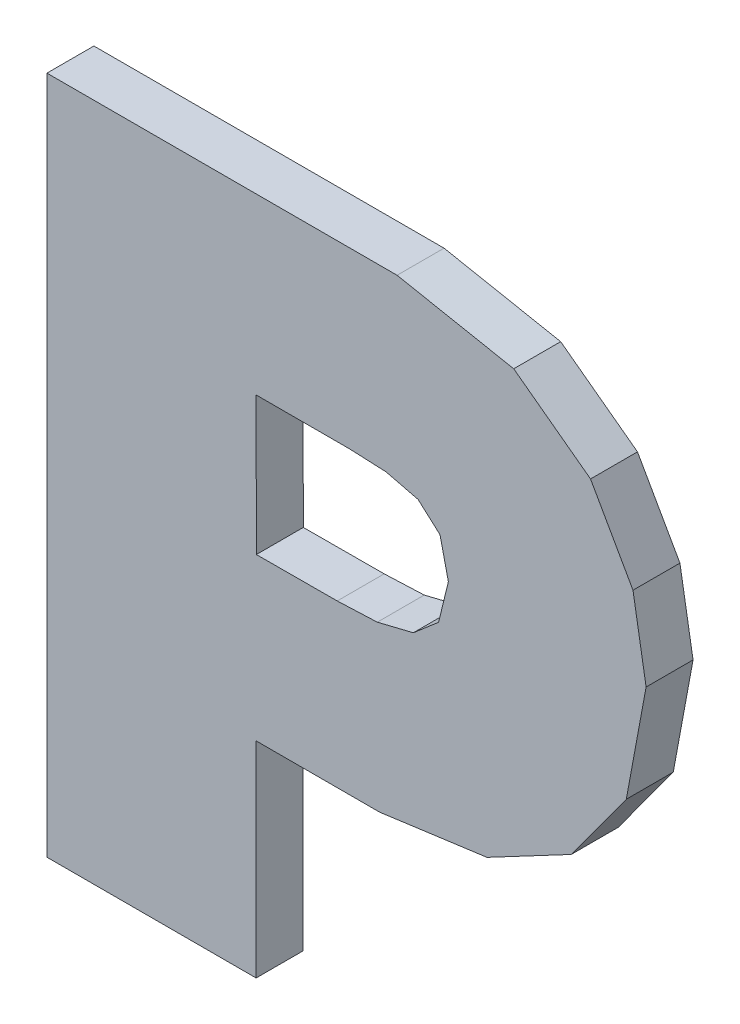
ISO-10303-21;
HEADER;
FILE_DESCRIPTION(('STEP AP214'),'2;1');
FILE_NAME('part.step','',(''),(''),'','','');
FILE_SCHEMA(('AUTOMOTIVE_DESIGN { 1 0 10303 214 1 1 1 1 }'));
ENDSEC;
DATA;
#1=APPLICATION_CONTEXT('core data for automotive mechanical design processes');
#2=APPLICATION_PROTOCOL_DEFINITION('international standard','automotive_design',2000,#1);
#3=PRODUCT_CONTEXT('',#1,'mechanical');
#4=PRODUCT('Part','Part','',(#3));
#5=PRODUCT_RELATED_PRODUCT_CATEGORY('part','',(#4));
#6=PRODUCT_DEFINITION_FORMATION('','',#4);
#7=PRODUCT_DEFINITION_CONTEXT('part definition',#1,'design');
#8=PRODUCT_DEFINITION('design','',#6,#7);
#9=PRODUCT_DEFINITION_SHAPE('','',#8);
#10=(LENGTH_UNIT() NAMED_UNIT(*) SI_UNIT(.MILLI.,.METRE.));
#11=(NAMED_UNIT(*) PLANE_ANGLE_UNIT() SI_UNIT($,.RADIAN.));
#12=(NAMED_UNIT(*) SI_UNIT($,.STERADIAN.) SOLID_ANGLE_UNIT());
#13=UNCERTAINTY_MEASURE_WITH_UNIT(LENGTH_MEASURE(1.E-05),#10,'distance_accuracy_value','');
#14=(GEOMETRIC_REPRESENTATION_CONTEXT(3) GLOBAL_UNCERTAINTY_ASSIGNED_CONTEXT((#13)) GLOBAL_UNIT_ASSIGNED_CONTEXT((#10,
#11,#12)) REPRESENTATION_CONTEXT('',''));
#15=CARTESIAN_POINT('',(0.,0.,0.));
#16=DIRECTION('',(0.,0.,1.));
#17=DIRECTION('',(1.,0.,0.));
#18=AXIS2_PLACEMENT_3D('',#15,#16,#17);
#19=CARTESIAN_POINT('',(0.,0.,0.));
#20=DIRECTION('',(0.,0.,1.));
#21=DIRECTION('',(1.,0.,0.));
#22=AXIS2_PLACEMENT_3D('',#19,#20,#21);
#23=PLANE('',#22);
#24=DIRECTION('',(-0.999133073092352,-0.041630544712178,0.));
#25=VECTOR('',#24,1.);
#26=CARTESIAN_POINT('',(3.64744,1.047242,0.));
#27=LINE('',#26,#25);
#28=CARTESIAN_POINT('',(3.64744,1.047242,0.));
#29=VERTEX_POINT('',#28);
#30=CARTESIAN_POINT('',(3.604768,1.045464,0.));
#31=VERTEX_POINT('',#30);
#32=EDGE_CURVE('E292',#29,#31,#27,.T.);
#33=ORIENTED_EDGE('',*,*,#32,.F.);
#34=DIRECTION('',(-0.971266974943377,-0.237992570019194,0.));
#35=VECTOR('',#34,1.);
#36=CARTESIAN_POINT('',(3.685794,1.05664,0.));
#37=LINE('',#36,#35);
#38=CARTESIAN_POINT('',(3.685794,1.05664,0.));
#39=VERTEX_POINT('',#38);
#40=EDGE_CURVE('E287',#39,#29,#37,.T.);
#41=ORIENTED_EDGE('',*,*,#40,.F.);
#42=DIRECTION('',(-0.758751100874912,-0.65138066207181,0.));
#43=VECTOR('',#42,1.);
#44=CARTESIAN_POINT('',(3.712718,1.079754,0.));
#45=LINE('',#44,#43);
#46=CARTESIAN_POINT('',(3.712718,1.079754,0.));
#47=VERTEX_POINT('',#46);
#48=EDGE_CURVE('E282',#47,#39,#45,.T.);
#49=ORIENTED_EDGE('',*,*,#48,.F.);
#50=DIRECTION('',(-0.2370892994148,-0.971487861016801,0.));
#51=VECTOR('',#50,1.);
#52=CARTESIAN_POINT('',(3.723132,1.122426,0.));
#53=LINE('',#52,#51);
#54=CARTESIAN_POINT('',(3.723132,1.122426,0.));
#55=VERTEX_POINT('',#54);
#56=EDGE_CURVE('E277',#55,#47,#53,.T.);
#57=ORIENTED_EDGE('',*,*,#56,.F.);
#58=DIRECTION('',(0.222997798612993,-0.974818948222571,0.));
#59=VECTOR('',#58,1.);
#60=CARTESIAN_POINT('',(3.714242,1.161288,0.));
#61=LINE('',#60,#59);
#62=CARTESIAN_POINT('',(3.714242,1.161288,0.));
#63=VERTEX_POINT('',#62);
#64=EDGE_CURVE('E272',#63,#55,#61,.T.);
#65=ORIENTED_EDGE('',*,*,#64,.F.);
#66=DIRECTION('',(0.746513271675736,-0.665370524754432,0.));
#67=VECTOR('',#66,1.);
#68=CARTESIAN_POINT('',(3.690874,1.182116,0.));
#69=LINE('',#68,#67);
#70=CARTESIAN_POINT('',(3.690874,1.182116,0.));
#71=VERTEX_POINT('',#70);
#72=EDGE_CURVE('E267',#71,#63,#69,.T.);
#73=ORIENTED_EDGE('',*,*,#72,.F.);
#74=DIRECTION('',(0.970988999783294,-0.239124156663099,0.));
#75=VECTOR('',#74,1.);
#76=CARTESIAN_POINT('',(3.656838,1.190498,0.));
#77=LINE('',#76,#75);
#78=CARTESIAN_POINT('',(3.656838,1.190498,0.));
#79=VERTEX_POINT('',#78);
#80=EDGE_CURVE('E262',#79,#71,#77,.T.);
#81=ORIENTED_EDGE('',*,*,#80,.F.);
#82=DIRECTION('',(0.998955034209112,-0.0457038250945306,0.));
#83=VECTOR('',#82,1.);
#84=CARTESIAN_POINT('',(3.617976,1.192276,0.));
#85=LINE('',#84,#83);
#86=CARTESIAN_POINT('',(3.6179759999999,1.192276,0.));
#87=VERTEX_POINT('',#86);
#88=EDGE_CURVE('E257',#87,#79,#85,.T.);
#89=ORIENTED_EDGE('',*,*,#88,.F.);
#90=DIRECTION('',(1.,0.,0.));
#91=VECTOR('',#90,1.);
#92=CARTESIAN_POINT('',(3.518408,1.192276,0.));
#93=LINE('',#92,#91);
#94=CARTESIAN_POINT('',(3.518408,1.192276,0.));
#95=VERTEX_POINT('',#94);
#96=EDGE_CURVE('E252',#95,#87,#93,.T.);
#97=ORIENTED_EDGE('',*,*,#96,.F.);
#98=DIRECTION('',(-0.00172711314082698,0.999998508538987,0.));
#99=VECTOR('',#98,1.);
#100=CARTESIAN_POINT('',(3.518662,1.04521,0.));
#101=LINE('',#100,#99);
#102=CARTESIAN_POINT('',(3.518662,1.04521,0.));
#103=VERTEX_POINT('',#102);
#104=EDGE_CURVE('E303',#103,#95,#101,.T.);
#105=ORIENTED_EDGE('',*,*,#104,.F.);
#106=DIRECTION('',(-0.999995649213487,-0.00294983967319596,0.));
#107=VECTOR('',#106,1.);
#108=CARTESIAN_POINT('',(3.604768,1.045464,0.));
#109=LINE('',#108,#107);
#110=EDGE_CURVE('E297',#31,#103,#109,.T.);
#111=ORIENTED_EDGE('',*,*,#110,.F.);
#112=EDGE_LOOP('',(#33,#41,#49,#57,#65,#73,#81,#89,#97,#105,#111));
#113=FACE_BOUND('',#112,.T.);
#114=DIRECTION('',(-0.981646719636242,0.190708462915008,0.));
#115=VECTOR('',#114,1.);
#116=CARTESIAN_POINT('',(3.792728,1.353566,0.));
#117=LINE('',#116,#115);
#118=CARTESIAN_POINT('',(3.792728,1.353566,0.));
#119=VERTEX_POINT('',#118);
#120=CARTESIAN_POINT('',(3.668522,1.377696,0.));
#121=VERTEX_POINT('',#120);
#122=EDGE_CURVE('E239',#119,#121,#117,.T.);
#123=ORIENTED_EDGE('',*,*,#122,.F.);
#124=DIRECTION('',(-0.802982531482504,0.596002562187403,0.));
#125=VECTOR('',#124,1.);
#126=CARTESIAN_POINT('',(3.874516,1.29286,0.));
#127=LINE('',#126,#125);
#128=CARTESIAN_POINT('',(3.874516,1.29286,0.));
#129=VERTEX_POINT('',#128);
#130=EDGE_CURVE('E234',#129,#119,#127,.T.);
#131=ORIENTED_EDGE('',*,*,#130,.F.);
#132=DIRECTION('',(-0.491966181390993,0.870614309764987,0.));
#133=VECTOR('',#132,1.);
#134=CARTESIAN_POINT('',(3.919728,1.21285,0.));
#135=LINE('',#134,#133);
#136=CARTESIAN_POINT('',(3.919728,1.21285,0.));
#137=VERTEX_POINT('',#136);
#138=EDGE_CURVE('E229',#137,#129,#135,.T.);
#139=ORIENTED_EDGE('',*,*,#138,.F.);
#140=DIRECTION('',(-0.167358895540908,0.985896039186347,0.));
#141=VECTOR('',#140,1.);
#142=CARTESIAN_POINT('',(3.933698,1.130554,0.));
#143=LINE('',#142,#141);
#144=CARTESIAN_POINT('',(3.933698,1.130554,0.));
#145=VERTEX_POINT('',#144);
#146=EDGE_CURVE('E224',#145,#137,#143,.T.);
#147=ORIENTED_EDGE('',*,*,#146,.F.);
#148=DIRECTION('',(0.181775554327793,0.983340046905862,0.));
#149=VECTOR('',#148,1.);
#150=CARTESIAN_POINT('',(3.912616,1.016508,0.));
#151=LINE('',#150,#149);
#152=CARTESIAN_POINT('',(3.912616,1.016508,0.));
#153=VERTEX_POINT('',#152);
#154=EDGE_CURVE('E219',#153,#145,#151,.T.);
#155=ORIENTED_EDGE('',*,*,#154,.F.);
#156=DIRECTION('',(0.590144688398872,0.807297495818362,0.));
#157=VECTOR('',#156,1.);
#158=CARTESIAN_POINT('',(3.853942,0.936244,0.));
#159=LINE('',#158,#157);
#160=CARTESIAN_POINT('',(3.853942,0.936243999999999,0.));
#161=VERTEX_POINT('',#160);
#162=EDGE_CURVE('E214',#161,#153,#159,.T.);
#163=ORIENTED_EDGE('',*,*,#162,.F.);
#164=DIRECTION('',(0.883666104082313,0.468117737856607,0.));
#165=VECTOR('',#164,1.);
#166=CARTESIAN_POINT('',(3.76428,0.888746,0.));
#167=LINE('',#166,#165);
#168=CARTESIAN_POINT('',(3.76428,0.888746000000001,0.));
#169=VERTEX_POINT('',#168);
#170=EDGE_CURVE('E209',#169,#161,#167,.T.);
#171=ORIENTED_EDGE('',*,*,#170,.F.);
#172=DIRECTION('',(0.990937056940698,0.1343270232742,0.));
#173=VECTOR('',#172,1.);
#174=CARTESIAN_POINT('',(3.64998,0.873252,0.));
#175=LINE('',#174,#173);
#176=CARTESIAN_POINT('',(3.64998000000001,0.873252000000001,0.));
#177=VERTEX_POINT('',#176);
#178=EDGE_CURVE('E204',#177,#169,#175,.T.);
#179=ORIENTED_EDGE('',*,*,#178,.F.);
#180=DIRECTION('',(1.,0.,0.));
#181=VECTOR('',#180,1.);
#182=CARTESIAN_POINT('',(3.518408,0.873252,0.));
#183=LINE('',#182,#181);
#184=CARTESIAN_POINT('',(3.518408,0.873252,0.));
#185=VERTEX_POINT('',#184);
#186=EDGE_CURVE('E190',#185,#177,#183,.T.);
#187=ORIENTED_EDGE('',*,*,#186,.F.);
#188=DIRECTION('',(0.,1.,0.));
#189=VECTOR('',#188,1.);
#190=CARTESIAN_POINT('',(3.518408,0.654558,0.));
#191=LINE('',#190,#189);
#192=CARTESIAN_POINT('',(3.518408,0.654558,0.));
#193=VERTEX_POINT('',#192);
#194=EDGE_CURVE('E175',#193,#185,#191,.T.);
#195=ORIENTED_EDGE('',*,*,#194,.F.);
#196=DIRECTION('',(1.,0.,0.));
#197=VECTOR('',#196,1.);
#198=CARTESIAN_POINT('',(3.29565,0.654558,0.));
#199=LINE('',#198,#197);
#200=CARTESIAN_POINT('',(3.29565,0.654558,0.));
#201=VERTEX_POINT('',#200);
#202=EDGE_CURVE('E20',#201,#193,#199,.T.);
#203=ORIENTED_EDGE('',*,*,#202,.F.);
#204=DIRECTION('',(0.,1.,0.));
#205=VECTOR('',#204,1.);
#206=CARTESIAN_POINT('',(3.29565,1.377696,0.));
#207=LINE('',#206,#205);
#208=CARTESIAN_POINT('',(3.29565,1.377696,0.));
#209=VERTEX_POINT('',#208);
#210=EDGE_CURVE('E250',#209,#201,#207,.F.);
#211=ORIENTED_EDGE('',*,*,#210,.F.);
#212=DIRECTION('',(1.,0.,0.));
#213=VECTOR('',#212,1.);
#214=CARTESIAN_POINT('',(3.668522,1.377696,0.));
#215=LINE('',#214,#213);
#216=EDGE_CURVE('E244',#121,#209,#215,.F.);
#217=ORIENTED_EDGE('',*,*,#216,.F.);
#218=EDGE_LOOP('',(#123,#131,#139,#147,#155,#163,#171,#179,#187,#195,#203,#211,#217));
#219=FACE_BOUND('',#218,.T.);
#220=ADVANCED_FACE('F17',(#113,#219),#23,.F.);
#221=CARTESIAN_POINT('',(3.29565,0.654558,0.));
#222=DIRECTION('',(0.,-1.,0.));
#223=DIRECTION('',(0.,0.,-1.));
#224=AXIS2_PLACEMENT_3D('',#221,#222,#223);
#225=PLANE('',#224);
#226=DIRECTION('',(0.,0.,1.));
#227=VECTOR('',#226,1.);
#228=CARTESIAN_POINT('',(3.29565,0.654558,0.));
#229=LINE('',#228,#227);
#230=CARTESIAN_POINT('',(3.29565,0.654558,0.05));
#231=VERTEX_POINT('',#230);
#232=EDGE_CURVE('E184',#201,#231,#229,.T.);
#233=ORIENTED_EDGE('',*,*,#232,.F.);
#234=ORIENTED_EDGE('',*,*,#202,.T.);
#235=DIRECTION('',(0.,0.,-1.));
#236=VECTOR('',#235,1.);
#237=CARTESIAN_POINT('',(3.518408,0.654558,0.));
#238=LINE('',#237,#236);
#239=CARTESIAN_POINT('',(3.518408,0.654558,0.05));
#240=VERTEX_POINT('',#239);
#241=EDGE_CURVE('E181',#240,#193,#238,.T.);
#242=ORIENTED_EDGE('',*,*,#241,.F.);
#243=DIRECTION('',(1.,0.,0.));
#244=VECTOR('',#243,1.);
#245=CARTESIAN_POINT('',(0.,0.654558,0.05));
#246=LINE('',#245,#244);
#247=EDGE_CURVE('E306',#231,#240,#246,.T.);
#248=ORIENTED_EDGE('',*,*,#247,.F.);
#249=EDGE_LOOP('',(#233,#234,#242,#248));
#250=FACE_BOUND('',#249,.T.);
#251=ADVANCED_FACE('F180',(#250),#225,.T.);
#252=CARTESIAN_POINT('',(3.518408,0.654558,0.));
#253=DIRECTION('',(1.,0.,0.));
#254=DIRECTION('',(0.,0.,-1.));
#255=AXIS2_PLACEMENT_3D('',#252,#253,#254);
#256=PLANE('',#255);
#257=ORIENTED_EDGE('',*,*,#241,.T.);
#258=ORIENTED_EDGE('',*,*,#194,.T.);
#259=DIRECTION('',(0.,0.,-1.));
#260=VECTOR('',#259,1.);
#261=CARTESIAN_POINT('',(3.518408,0.873252,0.));
#262=LINE('',#261,#260);
#263=CARTESIAN_POINT('',(3.518408,0.873252,0.05));
#264=VERTEX_POINT('',#263);
#265=EDGE_CURVE('E192',#264,#185,#262,.T.);
#266=ORIENTED_EDGE('',*,*,#265,.F.);
#267=DIRECTION('',(0.,1.,0.));
#268=VECTOR('',#267,1.);
#269=CARTESIAN_POINT('',(3.518408,0.,0.05));
#270=LINE('',#269,#268);
#271=EDGE_CURVE('E196',#240,#264,#270,.T.);
#272=ORIENTED_EDGE('',*,*,#271,.F.);
#273=EDGE_LOOP('',(#257,#258,#266,#272));
#274=FACE_BOUND('',#273,.T.);
#275=ADVANCED_FACE('F194',(#274),#256,.T.);
#276=CARTESIAN_POINT('',(3.518408,0.873252,0.));
#277=DIRECTION('',(0.,-1.,0.));
#278=DIRECTION('',(0.,0.,-1.));
#279=AXIS2_PLACEMENT_3D('',#276,#277,#278);
#280=PLANE('',#279);
#281=ORIENTED_EDGE('',*,*,#265,.T.);
#282=ORIENTED_EDGE('',*,*,#186,.T.);
#283=DIRECTION('',(0.,0.,1.));
#284=VECTOR('',#283,1.);
#285=CARTESIAN_POINT('',(3.64998,0.873252,0.));
#286=LINE('',#285,#284);
#287=CARTESIAN_POINT('',(3.64998000000001,0.873252000000001,0.05));
#288=VERTEX_POINT('',#287);
#289=EDGE_CURVE('E201',#288,#177,#286,.F.);
#290=ORIENTED_EDGE('',*,*,#289,.F.);
#291=DIRECTION('',(1.,0.,0.));
#292=VECTOR('',#291,1.);
#293=CARTESIAN_POINT('',(0.,0.873252,0.05));
#294=LINE('',#293,#292);
#295=EDGE_CURVE('E309',#264,#288,#294,.T.);
#296=ORIENTED_EDGE('',*,*,#295,.F.);
#297=EDGE_LOOP('',(#281,#282,#290,#296));
#298=FACE_BOUND('',#297,.T.);
#299=ADVANCED_FACE('F599',(#298),#280,.T.);
#300=CARTESIAN_POINT('',(3.64998,0.873252,0.));
#301=DIRECTION('',(0.1343270232742,-0.990937056940698,0.));
#302=DIRECTION('',(0.990937056940698,0.1343270232742,0.));
#303=AXIS2_PLACEMENT_3D('',#300,#301,#302);
#304=PLANE('',#303);
#305=ORIENTED_EDGE('',*,*,#289,.T.);
#306=ORIENTED_EDGE('',*,*,#178,.T.);
#307=DIRECTION('',(0.,0.,1.));
#308=VECTOR('',#307,1.);
#309=CARTESIAN_POINT('',(3.76428,0.888746,0.));
#310=LINE('',#309,#308);
#311=CARTESIAN_POINT('',(3.76428,0.888746000000001,0.05));
#312=VERTEX_POINT('',#311);
#313=EDGE_CURVE('E206',#312,#169,#310,.F.);
#314=ORIENTED_EDGE('',*,*,#313,.F.);
#315=DIRECTION('',(0.9909370569407,0.134327023274184,0.));
#316=VECTOR('',#315,1.);
#317=CARTESIAN_POINT('',(3.64998,0.873252,0.05));
#318=LINE('',#317,#316);
#319=EDGE_CURVE('E312',#288,#312,#318,.T.);
#320=ORIENTED_EDGE('',*,*,#319,.F.);
#321=EDGE_LOOP('',(#305,#306,#314,#320));
#322=FACE_BOUND('',#321,.T.);
#323=ADVANCED_FACE('F590',(#322),#304,.T.);
#324=CARTESIAN_POINT('',(3.76428,0.888746,0.));
#325=DIRECTION('',(0.468117737856607,-0.883666104082313,0.));
#326=DIRECTION('',(0.883666104082313,0.468117737856607,0.));
#327=AXIS2_PLACEMENT_3D('',#324,#325,#326);
#328=PLANE('',#327);
#329=ORIENTED_EDGE('',*,*,#313,.T.);
#330=ORIENTED_EDGE('',*,*,#170,.T.);
#331=DIRECTION('',(0.,0.,1.));
#332=VECTOR('',#331,1.);
#333=CARTESIAN_POINT('',(3.853942,0.936244,0.));
#334=LINE('',#333,#332);
#335=CARTESIAN_POINT('',(3.853942,0.936243999999999,0.05));
#336=VERTEX_POINT('',#335);
#337=EDGE_CURVE('E211',#336,#161,#334,.F.);
#338=ORIENTED_EDGE('',*,*,#337,.F.);
#339=DIRECTION('',(0.883666104082301,0.46811773785663,0.));
#340=VECTOR('',#339,1.);
#341=CARTESIAN_POINT('',(3.76428,0.888746,0.05));
#342=LINE('',#341,#340);
#343=EDGE_CURVE('E315',#312,#336,#342,.T.);
#344=ORIENTED_EDGE('',*,*,#343,.F.);
#345=EDGE_LOOP('',(#329,#330,#338,#344));
#346=FACE_BOUND('',#345,.T.);
#347=ADVANCED_FACE('F581',(#346),#328,.T.);
#348=CARTESIAN_POINT('',(3.853942,0.936244,0.));
#349=DIRECTION('',(0.807297495818362,-0.590144688398872,0.));
#350=DIRECTION('',(0.590144688398872,0.807297495818362,0.));
#351=AXIS2_PLACEMENT_3D('',#348,#349,#350);
#352=PLANE('',#351);
#353=ORIENTED_EDGE('',*,*,#337,.T.);
#354=ORIENTED_EDGE('',*,*,#162,.T.);
#355=DIRECTION('',(0.,0.,1.));
#356=VECTOR('',#355,1.);
#357=CARTESIAN_POINT('',(3.912616,1.016508,0.));
#358=LINE('',#357,#356);
#359=CARTESIAN_POINT('',(3.912616,1.016508,0.05));
#360=VERTEX_POINT('',#359);
#361=EDGE_CURVE('E216',#360,#153,#358,.F.);
#362=ORIENTED_EDGE('',*,*,#361,.F.);
#363=DIRECTION('',(0.590144688398868,0.807297495818365,0.));
#364=VECTOR('',#363,1.);
#365=CARTESIAN_POINT('',(3.853942,0.936244,0.05));
#366=LINE('',#365,#364);
#367=EDGE_CURVE('E318',#336,#360,#366,.T.);
#368=ORIENTED_EDGE('',*,*,#367,.F.);
#369=EDGE_LOOP('',(#353,#354,#362,#368));
#370=FACE_BOUND('',#369,.T.);
#371=ADVANCED_FACE('F572',(#370),#352,.T.);
#372=CARTESIAN_POINT('',(3.912616,1.016508,0.));
#373=DIRECTION('',(0.983340046905862,-0.181775554327793,0.));
#374=DIRECTION('',(0.181775554327793,0.983340046905862,0.));
#375=AXIS2_PLACEMENT_3D('',#372,#373,#374);
#376=PLANE('',#375);
#377=ORIENTED_EDGE('',*,*,#361,.T.);
#378=ORIENTED_EDGE('',*,*,#154,.T.);
#379=DIRECTION('',(0.,0.,1.));
#380=VECTOR('',#379,1.);
#381=CARTESIAN_POINT('',(3.933698,1.130554,0.));
#382=LINE('',#381,#380);
#383=CARTESIAN_POINT('',(3.933698,1.130554,0.05));
#384=VERTEX_POINT('',#383);
#385=EDGE_CURVE('E221',#384,#145,#382,.F.);
#386=ORIENTED_EDGE('',*,*,#385,.F.);
#387=DIRECTION('',(0.181775554327812,0.983340046905859,0.));
#388=VECTOR('',#387,1.);
#389=CARTESIAN_POINT('',(3.912616,1.016508,0.05));
#390=LINE('',#389,#388);
#391=EDGE_CURVE('E321',#360,#384,#390,.T.);
#392=ORIENTED_EDGE('',*,*,#391,.F.);
#393=EDGE_LOOP('',(#377,#378,#386,#392));
#394=FACE_BOUND('',#393,.T.);
#395=ADVANCED_FACE('F563',(#394),#376,.T.);
#396=CARTESIAN_POINT('',(3.933698,1.130554,0.));
#397=DIRECTION('',(0.985896039186347,0.167358895540908,0.));
#398=DIRECTION('',(-0.167358895540908,0.985896039186347,0.));
#399=AXIS2_PLACEMENT_3D('',#396,#397,#398);
#400=PLANE('',#399);
#401=ORIENTED_EDGE('',*,*,#385,.T.);
#402=ORIENTED_EDGE('',*,*,#146,.T.);
#403=DIRECTION('',(0.,0.,1.));
#404=VECTOR('',#403,1.);
#405=CARTESIAN_POINT('',(3.919728,1.21285,0.));
#406=LINE('',#405,#404);
#407=CARTESIAN_POINT('',(3.919728,1.21285,0.05));
#408=VERTEX_POINT('',#407);
#409=EDGE_CURVE('E226',#408,#137,#406,.F.);
#410=ORIENTED_EDGE('',*,*,#409,.F.);
#411=DIRECTION('',(-0.167358895540896,0.985896039186349,0.));
#412=VECTOR('',#411,1.);
#413=CARTESIAN_POINT('',(3.933698,1.130554,0.05));
#414=LINE('',#413,#412);
#415=EDGE_CURVE('E324',#384,#408,#414,.T.);
#416=ORIENTED_EDGE('',*,*,#415,.F.);
#417=EDGE_LOOP('',(#401,#402,#410,#416));
#418=FACE_BOUND('',#417,.T.);
#419=ADVANCED_FACE('F554',(#418),#400,.T.);
#420=CARTESIAN_POINT('',(3.919728,1.21285,0.));
#421=DIRECTION('',(0.870614309764987,0.491966181390993,0.));
#422=DIRECTION('',(-0.491966181390993,0.870614309764987,0.));
#423=AXIS2_PLACEMENT_3D('',#420,#421,#422);
#424=PLANE('',#423);
#425=ORIENTED_EDGE('',*,*,#409,.T.);
#426=ORIENTED_EDGE('',*,*,#138,.T.);
#427=DIRECTION('',(0.,0.,1.));
#428=VECTOR('',#427,1.);
#429=CARTESIAN_POINT('',(3.874516,1.29286,0.));
#430=LINE('',#429,#428);
#431=CARTESIAN_POINT('',(3.874516,1.29286,0.05));
#432=VERTEX_POINT('',#431);
#433=EDGE_CURVE('E231',#432,#129,#430,.F.);
#434=ORIENTED_EDGE('',*,*,#433,.F.);
#435=DIRECTION('',(-0.491966181391007,0.870614309764979,0.));
#436=VECTOR('',#435,1.);
#437=CARTESIAN_POINT('',(3.919728,1.21285,0.05));
#438=LINE('',#437,#436);
#439=EDGE_CURVE('E327',#408,#432,#438,.T.);
#440=ORIENTED_EDGE('',*,*,#439,.F.);
#441=EDGE_LOOP('',(#425,#426,#434,#440));
#442=FACE_BOUND('',#441,.T.);
#443=ADVANCED_FACE('F545',(#442),#424,.T.);
#444=CARTESIAN_POINT('',(3.874516,1.29286,0.));
#445=DIRECTION('',(0.596002562187403,0.802982531482504,0.));
#446=DIRECTION('',(-0.802982531482504,0.596002562187403,0.));
#447=AXIS2_PLACEMENT_3D('',#444,#445,#446);
#448=PLANE('',#447);
#449=ORIENTED_EDGE('',*,*,#433,.T.);
#450=ORIENTED_EDGE('',*,*,#130,.T.);
#451=DIRECTION('',(0.,0.,1.));
#452=VECTOR('',#451,1.);
#453=CARTESIAN_POINT('',(3.792728,1.353566,0.));
#454=LINE('',#453,#452);
#455=CARTESIAN_POINT('',(3.792728,1.353566,0.05));
#456=VERTEX_POINT('',#455);
#457=EDGE_CURVE('E236',#456,#119,#454,.F.);
#458=ORIENTED_EDGE('',*,*,#457,.F.);
#459=DIRECTION('',(-0.80298253148254,0.596002562187355,0.));
#460=VECTOR('',#459,1.);
#461=CARTESIAN_POINT('',(3.874516,1.29286,0.05));
#462=LINE('',#461,#460);
#463=EDGE_CURVE('E330',#432,#456,#462,.T.);
#464=ORIENTED_EDGE('',*,*,#463,.F.);
#465=EDGE_LOOP('',(#449,#450,#458,#464));
#466=FACE_BOUND('',#465,.T.);
#467=ADVANCED_FACE('F536',(#466),#448,.T.);
#468=CARTESIAN_POINT('',(3.792728,1.353566,0.));
#469=DIRECTION('',(0.190708462915008,0.981646719636242,0.));
#470=DIRECTION('',(-0.981646719636242,0.190708462915008,0.));
#471=AXIS2_PLACEMENT_3D('',#468,#469,#470);
#472=PLANE('',#471);
#473=ORIENTED_EDGE('',*,*,#457,.T.);
#474=ORIENTED_EDGE('',*,*,#122,.T.);
#475=DIRECTION('',(0.,0.,1.));
#476=VECTOR('',#475,1.);
#477=CARTESIAN_POINT('',(3.668522,1.377696,0.));
#478=LINE('',#477,#476);
#479=CARTESIAN_POINT('',(3.668522,1.377696,0.05));
#480=VERTEX_POINT('',#479);
#481=EDGE_CURVE('E241',#480,#121,#478,.F.);
#482=ORIENTED_EDGE('',*,*,#481,.F.);
#483=DIRECTION('',(-0.981646719636241,0.190708462915016,0.));
#484=VECTOR('',#483,1.);
#485=CARTESIAN_POINT('',(3.792728,1.353566,0.05));
#486=LINE('',#485,#484);
#487=EDGE_CURVE('E333',#456,#480,#486,.T.);
#488=ORIENTED_EDGE('',*,*,#487,.F.);
#489=EDGE_LOOP('',(#473,#474,#482,#488));
#490=FACE_BOUND('',#489,.T.);
#491=ADVANCED_FACE('F527',(#490),#472,.T.);
#492=CARTESIAN_POINT('',(3.668522,1.377696,0.));
#493=DIRECTION('',(0.,1.,0.));
#494=DIRECTION('',(0.,0.,1.));
#495=AXIS2_PLACEMENT_3D('',#492,#493,#494);
#496=PLANE('',#495);
#497=ORIENTED_EDGE('',*,*,#481,.T.);
#498=ORIENTED_EDGE('',*,*,#216,.T.);
#499=DIRECTION('',(0.,0.,1.));
#500=VECTOR('',#499,1.);
#501=CARTESIAN_POINT('',(3.29565,1.377696,0.));
#502=LINE('',#501,#500);
#503=CARTESIAN_POINT('',(3.29565,1.377696,0.05));
#504=VERTEX_POINT('',#503);
#505=EDGE_CURVE('E247',#504,#209,#502,.F.);
#506=ORIENTED_EDGE('',*,*,#505,.F.);
#507=DIRECTION('',(1.,0.,0.));
#508=VECTOR('',#507,1.);
#509=CARTESIAN_POINT('',(0.,1.377696,0.05));
#510=LINE('',#509,#508);
#511=EDGE_CURVE('E336',#480,#504,#510,.F.);
#512=ORIENTED_EDGE('',*,*,#511,.F.);
#513=EDGE_LOOP('',(#497,#498,#506,#512));
#514=FACE_BOUND('',#513,.T.);
#515=ADVANCED_FACE('F518',(#514),#496,.T.);
#516=CARTESIAN_POINT('',(3.29565,1.377696,0.));
#517=DIRECTION('',(-1.,0.,0.));
#518=DIRECTION('',(0.,0.,1.));
#519=AXIS2_PLACEMENT_3D('',#516,#517,#518);
#520=PLANE('',#519);
#521=ORIENTED_EDGE('',*,*,#505,.T.);
#522=ORIENTED_EDGE('',*,*,#210,.T.);
#523=ORIENTED_EDGE('',*,*,#232,.T.);
#524=DIRECTION('',(0.,1.,0.));
#525=VECTOR('',#524,1.);
#526=CARTESIAN_POINT('',(3.29565,0.,0.05));
#527=LINE('',#526,#525);
#528=EDGE_CURVE('E339',#504,#231,#527,.F.);
#529=ORIENTED_EDGE('',*,*,#528,.F.);
#530=EDGE_LOOP('',(#521,#522,#523,#529));
#531=FACE_BOUND('',#530,.T.);
#532=ADVANCED_FACE('F510',(#531),#520,.T.);
#533=CARTESIAN_POINT('',(3.518408,1.192276,0.));
#534=DIRECTION('',(0.,-1.,0.));
#535=DIRECTION('',(0.,0.,-1.));
#536=AXIS2_PLACEMENT_3D('',#533,#534,#535);
#537=PLANE('',#536);
#538=DIRECTION('',(0.,0.,1.));
#539=VECTOR('',#538,1.);
#540=CARTESIAN_POINT('',(3.518408,1.192276,0.));
#541=LINE('',#540,#539);
#542=CARTESIAN_POINT('',(3.518408,1.192276,0.05));
#543=VERTEX_POINT('',#542);
#544=EDGE_CURVE('E299',#95,#543,#541,.T.);
#545=ORIENTED_EDGE('',*,*,#544,.F.);
#546=ORIENTED_EDGE('',*,*,#96,.T.);
#547=DIRECTION('',(0.,0.,1.));
#548=VECTOR('',#547,1.);
#549=CARTESIAN_POINT('',(3.617976,1.192276,0.));
#550=LINE('',#549,#548);
#551=CARTESIAN_POINT('',(3.6179759999999,1.192276,0.05));
#552=VERTEX_POINT('',#551);
#553=EDGE_CURVE('E254',#552,#87,#550,.F.);
#554=ORIENTED_EDGE('',*,*,#553,.F.);
#555=DIRECTION('',(1.,0.,0.));
#556=VECTOR('',#555,1.);
#557=CARTESIAN_POINT('',(0.,1.192276,0.05));
#558=LINE('',#557,#556);
#559=EDGE_CURVE('E342',#543,#552,#558,.T.);
#560=ORIENTED_EDGE('',*,*,#559,.F.);
#561=EDGE_LOOP('',(#545,#546,#554,#560));
#562=FACE_BOUND('',#561,.T.);
#563=ADVANCED_FACE('F387',(#562),#537,.T.);
#564=CARTESIAN_POINT('',(3.617976,1.192276,0.));
#565=DIRECTION('',(-0.0457038250945306,-0.998955034209112,0.));
#566=DIRECTION('',(0.998955034209112,-0.0457038250945306,0.));
#567=AXIS2_PLACEMENT_3D('',#564,#565,#566);
#568=PLANE('',#567);
#569=ORIENTED_EDGE('',*,*,#553,.T.);
#570=ORIENTED_EDGE('',*,*,#88,.T.);
#571=DIRECTION('',(0.,0.,1.));
#572=VECTOR('',#571,1.);
#573=CARTESIAN_POINT('',(3.656838,1.190498,0.));
#574=LINE('',#573,#572);
#575=CARTESIAN_POINT('',(3.656838,1.190498,0.05));
#576=VERTEX_POINT('',#575);
#577=EDGE_CURVE('E259',#576,#79,#574,.F.);
#578=ORIENTED_EDGE('',*,*,#577,.F.);
#579=DIRECTION('',(0.998955034209112,-0.0457038250945299,0.));
#580=VECTOR('',#579,1.);
#581=CARTESIAN_POINT('',(3.617976,1.192276,0.05));
#582=LINE('',#581,#580);
#583=EDGE_CURVE('E345',#552,#576,#582,.T.);
#584=ORIENTED_EDGE('',*,*,#583,.F.);
#585=EDGE_LOOP('',(#569,#570,#578,#584));
#586=FACE_BOUND('',#585,.T.);
#587=ADVANCED_FACE('F391',(#586),#568,.T.);
#588=CARTESIAN_POINT('',(3.656838,1.190498,0.));
#589=DIRECTION('',(-0.239124156663099,-0.970988999783294,0.));
#590=DIRECTION('',(0.970988999783294,-0.239124156663099,0.));
#591=AXIS2_PLACEMENT_3D('',#588,#589,#590);
#592=PLANE('',#591);
#593=ORIENTED_EDGE('',*,*,#577,.T.);
#594=ORIENTED_EDGE('',*,*,#80,.T.);
#595=DIRECTION('',(0.,0.,1.));
#596=VECTOR('',#595,1.);
#597=CARTESIAN_POINT('',(3.690874,1.182116,0.));
#598=LINE('',#597,#596);
#599=CARTESIAN_POINT('',(3.690874,1.182116,0.05));
#600=VERTEX_POINT('',#599);
#601=EDGE_CURVE('E264',#600,#71,#598,.F.);
#602=ORIENTED_EDGE('',*,*,#601,.F.);
#603=DIRECTION('',(0.970988999783305,-0.239124156663054,0.));
#604=VECTOR('',#603,1.);
#605=CARTESIAN_POINT('',(3.656838,1.190498,0.05));
#606=LINE('',#605,#604);
#607=EDGE_CURVE('E348',#576,#600,#606,.T.);
#608=ORIENTED_EDGE('',*,*,#607,.F.);
#609=EDGE_LOOP('',(#593,#594,#602,#608));
#610=FACE_BOUND('',#609,.T.);
#611=ADVANCED_FACE('F394',(#610),#592,.T.);
#612=CARTESIAN_POINT('',(3.690874,1.182116,0.));
#613=DIRECTION('',(-0.665370524754432,-0.746513271675736,0.));
#614=DIRECTION('',(0.746513271675736,-0.665370524754432,0.));
#615=AXIS2_PLACEMENT_3D('',#612,#613,#614);
#616=PLANE('',#615);
#617=ORIENTED_EDGE('',*,*,#601,.T.);
#618=ORIENTED_EDGE('',*,*,#72,.T.);
#619=DIRECTION('',(0.,0.,1.));
#620=VECTOR('',#619,1.);
#621=CARTESIAN_POINT('',(3.714242,1.161288,0.));
#622=LINE('',#621,#620);
#623=CARTESIAN_POINT('',(3.714242,1.161288,0.05));
#624=VERTEX_POINT('',#623);
#625=EDGE_CURVE('E269',#624,#63,#622,.F.);
#626=ORIENTED_EDGE('',*,*,#625,.F.);
#627=DIRECTION('',(0.746513271675721,-0.66537052475445,0.));
#628=VECTOR('',#627,1.);
#629=CARTESIAN_POINT('',(3.690874,1.182116,0.05));
#630=LINE('',#629,#628);
#631=EDGE_CURVE('E351',#600,#624,#630,.T.);
#632=ORIENTED_EDGE('',*,*,#631,.F.);
#633=EDGE_LOOP('',(#617,#618,#626,#632));
#634=FACE_BOUND('',#633,.T.);
#635=ADVANCED_FACE('F398',(#634),#616,.T.);
#636=CARTESIAN_POINT('',(3.714242,1.161288,0.));
#637=DIRECTION('',(-0.974818948222571,-0.222997798612993,0.));
#638=DIRECTION('',(0.222997798612993,-0.974818948222571,0.));
#639=AXIS2_PLACEMENT_3D('',#636,#637,#638);
#640=PLANE('',#639);
#641=ORIENTED_EDGE('',*,*,#625,.T.);
#642=ORIENTED_EDGE('',*,*,#64,.T.);
#643=DIRECTION('',(0.,0.,1.));
#644=VECTOR('',#643,1.);
#645=CARTESIAN_POINT('',(3.723132,1.122426,0.));
#646=LINE('',#645,#644);
#647=CARTESIAN_POINT('',(3.723132,1.122426,0.05));
#648=VERTEX_POINT('',#647);
#649=EDGE_CURVE('E274',#648,#55,#646,.F.);
#650=ORIENTED_EDGE('',*,*,#649,.F.);
#651=DIRECTION('',(0.222997798613007,-0.974818948222567,0.));
#652=VECTOR('',#651,1.);
#653=CARTESIAN_POINT('',(3.714242,1.161288,0.05));
#654=LINE('',#653,#652);
#655=EDGE_CURVE('E354',#624,#648,#654,.T.);
#656=ORIENTED_EDGE('',*,*,#655,.F.);
#657=EDGE_LOOP('',(#641,#642,#650,#656));
#658=FACE_BOUND('',#657,.T.);
#659=ADVANCED_FACE('F402',(#658),#640,.T.);
#660=CARTESIAN_POINT('',(3.723132,1.122426,0.));
#661=DIRECTION('',(-0.971487861016801,0.2370892994148,0.));
#662=DIRECTION('',(-0.2370892994148,-0.971487861016801,0.));
#663=AXIS2_PLACEMENT_3D('',#660,#661,#662);
#664=PLANE('',#663);
#665=ORIENTED_EDGE('',*,*,#649,.T.);
#666=ORIENTED_EDGE('',*,*,#56,.T.);
#667=DIRECTION('',(0.,0.,1.));
#668=VECTOR('',#667,1.);
#669=CARTESIAN_POINT('',(3.712718,1.079754,0.));
#670=LINE('',#669,#668);
#671=CARTESIAN_POINT('',(3.712718,1.079754,0.05));
#672=VERTEX_POINT('',#671);
#673=EDGE_CURVE('E279',#672,#47,#670,.F.);
#674=ORIENTED_EDGE('',*,*,#673,.F.);
#675=DIRECTION('',(-0.23708929941481,-0.971487861016799,0.));
#676=VECTOR('',#675,1.);
#677=CARTESIAN_POINT('',(3.723132,1.122426,0.05));
#678=LINE('',#677,#676);
#679=EDGE_CURVE('E357',#648,#672,#678,.T.);
#680=ORIENTED_EDGE('',*,*,#679,.F.);
#681=EDGE_LOOP('',(#665,#666,#674,#680));
#682=FACE_BOUND('',#681,.T.);
#683=ADVANCED_FACE('F406',(#682),#664,.T.);
#684=CARTESIAN_POINT('',(3.712718,1.079754,0.));
#685=DIRECTION('',(-0.65138066207181,0.758751100874912,0.));
#686=DIRECTION('',(-0.758751100874912,-0.65138066207181,0.));
#687=AXIS2_PLACEMENT_3D('',#684,#685,#686);
#688=PLANE('',#687);
#689=ORIENTED_EDGE('',*,*,#673,.T.);
#690=ORIENTED_EDGE('',*,*,#48,.T.);
#691=DIRECTION('',(0.,0.,1.));
#692=VECTOR('',#691,1.);
#693=CARTESIAN_POINT('',(3.685794,1.05664,0.));
#694=LINE('',#693,#692);
#695=CARTESIAN_POINT('',(3.685794,1.05664,0.05));
#696=VERTEX_POINT('',#695);
#697=EDGE_CURVE('E284',#696,#39,#694,.F.);
#698=ORIENTED_EDGE('',*,*,#697,.F.);
#699=DIRECTION('',(-0.75875110087489,-0.651380662071836,0.));
#700=VECTOR('',#699,1.);
#701=CARTESIAN_POINT('',(3.712718,1.079754,0.05));
#702=LINE('',#701,#700);
#703=EDGE_CURVE('E360',#672,#696,#702,.T.);
#704=ORIENTED_EDGE('',*,*,#703,.F.);
#705=EDGE_LOOP('',(#689,#690,#698,#704));
#706=FACE_BOUND('',#705,.T.);
#707=ADVANCED_FACE('F410',(#706),#688,.T.);
#708=CARTESIAN_POINT('',(3.685794,1.05664,0.));
#709=DIRECTION('',(-0.237992570019194,0.971266974943377,0.));
#710=DIRECTION('',(-0.971266974943377,-0.237992570019194,0.));
#711=AXIS2_PLACEMENT_3D('',#708,#709,#710);
#712=PLANE('',#711);
#713=ORIENTED_EDGE('',*,*,#697,.T.);
#714=ORIENTED_EDGE('',*,*,#40,.T.);
#715=DIRECTION('',(0.,0.,1.));
#716=VECTOR('',#715,1.);
#717=CARTESIAN_POINT('',(3.64744,1.047242,0.));
#718=LINE('',#717,#716);
#719=CARTESIAN_POINT('',(3.64744,1.047242,0.05));
#720=VERTEX_POINT('',#719);
#721=EDGE_CURVE('E289',#720,#29,#718,.F.);
#722=ORIENTED_EDGE('',*,*,#721,.F.);
#723=DIRECTION('',(-0.971266974943368,-0.237992570019233,0.));
#724=VECTOR('',#723,1.);
#725=CARTESIAN_POINT('',(3.685794,1.05664,0.05));
#726=LINE('',#725,#724);
#727=EDGE_CURVE('E363',#696,#720,#726,.T.);
#728=ORIENTED_EDGE('',*,*,#727,.F.);
#729=EDGE_LOOP('',(#713,#714,#722,#728));
#730=FACE_BOUND('',#729,.T.);
#731=ADVANCED_FACE('F413',(#730),#712,.T.);
#732=CARTESIAN_POINT('',(3.64744,1.047242,0.));
#733=DIRECTION('',(-0.041630544712178,0.999133073092352,0.));
#734=DIRECTION('',(-0.999133073092352,-0.041630544712178,0.));
#735=AXIS2_PLACEMENT_3D('',#732,#733,#734);
#736=PLANE('',#735);
#737=ORIENTED_EDGE('',*,*,#721,.T.);
#738=ORIENTED_EDGE('',*,*,#32,.T.);
#739=DIRECTION('',(0.,0.,1.));
#740=VECTOR('',#739,1.);
#741=CARTESIAN_POINT('',(3.604768,1.045464,0.));
#742=LINE('',#741,#740);
#743=CARTESIAN_POINT('',(3.604768,1.045464,0.05));
#744=VERTEX_POINT('',#743);
#745=EDGE_CURVE('E294',#744,#31,#742,.F.);
#746=ORIENTED_EDGE('',*,*,#745,.F.);
#747=DIRECTION('',(-0.999133073092352,-0.0416305447121817,0.));
#748=VECTOR('',#747,1.);
#749=CARTESIAN_POINT('',(3.64744,1.047242,0.05));
#750=LINE('',#749,#748);
#751=EDGE_CURVE('E366',#720,#744,#750,.T.);
#752=ORIENTED_EDGE('',*,*,#751,.F.);
#753=EDGE_LOOP('',(#737,#738,#746,#752));
#754=FACE_BOUND('',#753,.T.);
#755=ADVANCED_FACE('F378',(#754),#736,.T.);
#756=CARTESIAN_POINT('',(3.604768,1.045464,0.));
#757=DIRECTION('',(-0.00294983967319596,0.999995649213487,0.));
#758=DIRECTION('',(-0.999995649213487,-0.00294983967319596,0.));
#759=AXIS2_PLACEMENT_3D('',#756,#757,#758);
#760=PLANE('',#759);
#761=ORIENTED_EDGE('',*,*,#745,.T.);
#762=ORIENTED_EDGE('',*,*,#110,.T.);
#763=DIRECTION('',(0.,0.,1.));
#764=VECTOR('',#763,1.);
#765=CARTESIAN_POINT('',(3.518662,1.04521,0.));
#766=LINE('',#765,#764);
#767=CARTESIAN_POINT('',(3.518662,1.04521,0.05));
#768=VERTEX_POINT('',#767);
#769=EDGE_CURVE('E35',#768,#103,#766,.F.);
#770=ORIENTED_EDGE('',*,*,#769,.F.);
#771=DIRECTION('',(-0.999995649213487,-0.00294983967319725,0.));
#772=VECTOR('',#771,1.);
#773=CARTESIAN_POINT('',(3.604768,1.045464,0.05));
#774=LINE('',#773,#772);
#775=EDGE_CURVE('E26',#744,#768,#774,.T.);
#776=ORIENTED_EDGE('',*,*,#775,.F.);
#777=EDGE_LOOP('',(#761,#762,#770,#776));
#778=FACE_BOUND('',#777,.T.);
#779=ADVANCED_FACE('F374',(#778),#760,.T.);
#780=CARTESIAN_POINT('',(3.518662,1.04521,0.));
#781=DIRECTION('',(0.999998508538987,0.00172711314082698,0.));
#782=DIRECTION('',(-0.00172711314082698,0.999998508538987,0.));
#783=AXIS2_PLACEMENT_3D('',#780,#781,#782);
#784=PLANE('',#783);
#785=ORIENTED_EDGE('',*,*,#769,.T.);
#786=ORIENTED_EDGE('',*,*,#104,.T.);
#787=ORIENTED_EDGE('',*,*,#544,.T.);
#788=DIRECTION('',(-0.00172711314082645,0.999998508538987,0.));
#789=VECTOR('',#788,1.);
#790=CARTESIAN_POINT('',(3.518662,1.04521,0.05));
#791=LINE('',#790,#789);
#792=EDGE_CURVE('E11',#768,#543,#791,.T.);
#793=ORIENTED_EDGE('',*,*,#792,.F.);
#794=EDGE_LOOP('',(#785,#786,#787,#793));
#795=FACE_BOUND('',#794,.T.);
#796=ADVANCED_FACE('F385',(#795),#784,.T.);
#797=CARTESIAN_POINT('',(0.,0.,0.05));
#798=DIRECTION('',(0.,0.,1.));
#799=DIRECTION('',(1.,0.,0.));
#800=AXIS2_PLACEMENT_3D('',#797,#798,#799);
#801=PLANE('',#800);
#802=ORIENTED_EDGE('',*,*,#775,.T.);
#803=ORIENTED_EDGE('',*,*,#792,.T.);
#804=ORIENTED_EDGE('',*,*,#559,.T.);
#805=ORIENTED_EDGE('',*,*,#583,.T.);
#806=ORIENTED_EDGE('',*,*,#607,.T.);
#807=ORIENTED_EDGE('',*,*,#631,.T.);
#808=ORIENTED_EDGE('',*,*,#655,.T.);
#809=ORIENTED_EDGE('',*,*,#679,.T.);
#810=ORIENTED_EDGE('',*,*,#703,.T.);
#811=ORIENTED_EDGE('',*,*,#727,.T.);
#812=ORIENTED_EDGE('',*,*,#751,.T.);
#813=EDGE_LOOP('',(#802,#803,#804,#805,#806,#807,#808,#809,#810,#811,#812));
#814=FACE_BOUND('',#813,.T.);
#815=ORIENTED_EDGE('',*,*,#511,.T.);
#816=ORIENTED_EDGE('',*,*,#528,.T.);
#817=ORIENTED_EDGE('',*,*,#247,.T.);
#818=ORIENTED_EDGE('',*,*,#271,.T.);
#819=ORIENTED_EDGE('',*,*,#295,.T.);
#820=ORIENTED_EDGE('',*,*,#319,.T.);
#821=ORIENTED_EDGE('',*,*,#343,.T.);
#822=ORIENTED_EDGE('',*,*,#367,.T.);
#823=ORIENTED_EDGE('',*,*,#391,.T.);
#824=ORIENTED_EDGE('',*,*,#415,.T.);
#825=ORIENTED_EDGE('',*,*,#439,.T.);
#826=ORIENTED_EDGE('',*,*,#463,.T.);
#827=ORIENTED_EDGE('',*,*,#487,.T.);
#828=EDGE_LOOP('',(#815,#816,#817,#818,#819,#820,#821,#822,#823,#824,#825,#826,#827));
#829=FACE_BOUND('',#828,.T.);
#830=ADVANCED_FACE('F371',(#814,#829),#801,.T.);
#831=CLOSED_SHELL('',(#220,#251,#275,#299,#323,#347,#371,#395,#419,#443,#467,#491,#515,#532,
#563,#587,#611,#635,#659,#683,#707,#731,#755,#779,#796,#830));
#832=MANIFOLD_SOLID_BREP('B1',#831);
#833=ADVANCED_BREP_SHAPE_REPRESENTATION('',(#18,#832),#14);
#834=SHAPE_DEFINITION_REPRESENTATION(#9,#833);
ENDSEC;
END-ISO-10303-21;
